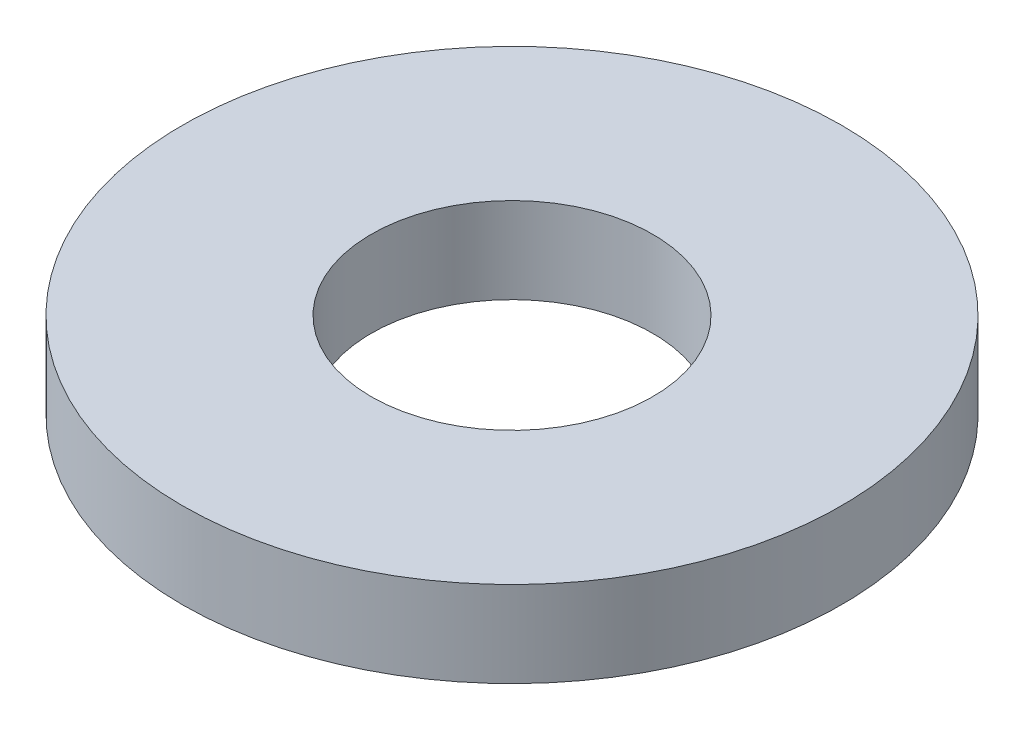
ISO-10303-21;
HEADER;
FILE_DESCRIPTION(('STEP AP214'),'2;1');
FILE_NAME('part.step','',(''),(''),'','','');
FILE_SCHEMA(('AUTOMOTIVE_DESIGN { 1 0 10303 214 1 1 1 1 }'));
ENDSEC;
DATA;
#1=APPLICATION_CONTEXT('core data for automotive mechanical design processes');
#2=APPLICATION_PROTOCOL_DEFINITION('international standard','automotive_design',2000,#1);
#3=PRODUCT_CONTEXT('',#1,'mechanical');
#4=PRODUCT('Part','Part','',(#3));
#5=PRODUCT_RELATED_PRODUCT_CATEGORY('part','',(#4));
#6=PRODUCT_DEFINITION_FORMATION('','',#4);
#7=PRODUCT_DEFINITION_CONTEXT('part definition',#1,'design');
#8=PRODUCT_DEFINITION('design','',#6,#7);
#9=PRODUCT_DEFINITION_SHAPE('','',#8);
#10=(LENGTH_UNIT() NAMED_UNIT(*) SI_UNIT(.MILLI.,.METRE.));
#11=(NAMED_UNIT(*) PLANE_ANGLE_UNIT() SI_UNIT($,.RADIAN.));
#12=(NAMED_UNIT(*) SI_UNIT($,.STERADIAN.) SOLID_ANGLE_UNIT());
#13=UNCERTAINTY_MEASURE_WITH_UNIT(LENGTH_MEASURE(1.E-05),#10,'distance_accuracy_value','');
#14=(GEOMETRIC_REPRESENTATION_CONTEXT(3) GLOBAL_UNCERTAINTY_ASSIGNED_CONTEXT((#13)) GLOBAL_UNIT_ASSIGNED_CONTEXT((#10,
#11,#12)) REPRESENTATION_CONTEXT('',''));
#15=CARTESIAN_POINT('',(0.,0.,0.));
#16=DIRECTION('',(0.,0.,1.));
#17=DIRECTION('',(1.,0.,0.));
#18=AXIS2_PLACEMENT_3D('',#15,#16,#17);
#19=CARTESIAN_POINT('',(0.,-0.625,0.));
#20=DIRECTION('',(0.,1.,0.));
#21=DIRECTION('',(0.,0.,1.));
#22=AXIS2_PLACEMENT_3D('',#19,#20,#21);
#23=CYLINDRICAL_SURFACE('',#22,4.8);
#24=CARTESIAN_POINT('',(0.,-0.625,0.));
#25=DIRECTION('',(0.,1.,0.));
#26=DIRECTION('',(0.,0.,1.));
#27=AXIS2_PLACEMENT_3D('',#24,#25,#26);
#28=CIRCLE('',#27,4.8);
#29=CARTESIAN_POINT('',(0.,-0.625,4.8));
#30=VERTEX_POINT('',#29);
#31=EDGE_CURVE('E10',#30,#30,#28,.T.);
#32=ORIENTED_EDGE('',*,*,#31,.T.);
#33=EDGE_LOOP('',(#32));
#34=FACE_BOUND('',#33,.T.);
#35=CARTESIAN_POINT('',(0.,0.625,0.));
#36=DIRECTION('',(0.,1.,0.));
#37=DIRECTION('',(0.,0.,1.));
#38=AXIS2_PLACEMENT_3D('',#35,#36,#37);
#39=CIRCLE('',#38,4.8);
#40=CARTESIAN_POINT('',(0.,0.625,4.8));
#41=VERTEX_POINT('',#40);
#42=EDGE_CURVE('E41',#41,#41,#39,.T.);
#43=ORIENTED_EDGE('',*,*,#42,.F.);
#44=EDGE_LOOP('',(#43));
#45=FACE_BOUND('',#44,.T.);
#46=ADVANCED_FACE('F31',(#34,#45),#23,.T.);
#47=CARTESIAN_POINT('',(0.,-0.625,0.));
#48=DIRECTION('',(0.,1.,0.));
#49=DIRECTION('',(0.,0.,1.));
#50=AXIS2_PLACEMENT_3D('',#47,#48,#49);
#51=PLANE('',#50);
#52=CARTESIAN_POINT('',(0.,-0.625,0.));
#53=DIRECTION('',(0.,1.,0.));
#54=DIRECTION('',(0.,0.,1.));
#55=AXIS2_PLACEMENT_3D('',#52,#53,#54);
#56=CIRCLE('',#55,2.05);
#57=CARTESIAN_POINT('',(0.,-0.625,2.05));
#58=VERTEX_POINT('',#57);
#59=EDGE_CURVE('E37',#58,#58,#56,.T.);
#60=ORIENTED_EDGE('',*,*,#59,.T.);
#61=EDGE_LOOP('',(#60));
#62=FACE_BOUND('',#61,.T.);
#63=ORIENTED_EDGE('',*,*,#31,.F.);
#64=EDGE_LOOP('',(#63));
#65=FACE_BOUND('',#64,.T.);
#66=ADVANCED_FACE('F60',(#62,#65),#51,.F.);
#67=CARTESIAN_POINT('',(0.,-0.625,0.));
#68=DIRECTION('',(0.,1.,0.));
#69=DIRECTION('',(0.,0.,1.));
#70=AXIS2_PLACEMENT_3D('',#67,#68,#69);
#71=CYLINDRICAL_SURFACE('',#70,2.05);
#72=ORIENTED_EDGE('',*,*,#59,.F.);
#73=EDGE_LOOP('',(#72));
#74=FACE_BOUND('',#73,.T.);
#75=CARTESIAN_POINT('',(0.,0.625,0.));
#76=DIRECTION('',(0.,1.,0.));
#77=DIRECTION('',(0.,0.,1.));
#78=AXIS2_PLACEMENT_3D('',#75,#76,#77);
#79=CIRCLE('',#78,2.05);
#80=CARTESIAN_POINT('',(0.,0.625,2.05));
#81=VERTEX_POINT('',#80);
#82=EDGE_CURVE('E45',#81,#81,#79,.T.);
#83=ORIENTED_EDGE('',*,*,#82,.T.);
#84=EDGE_LOOP('',(#83));
#85=FACE_BOUND('',#84,.T.);
#86=ADVANCED_FACE('F51',(#74,#85),#71,.F.);
#87=CARTESIAN_POINT('',(0.,0.625,0.));
#88=DIRECTION('',(0.,1.,0.));
#89=DIRECTION('',(0.,0.,1.));
#90=AXIS2_PLACEMENT_3D('',#87,#88,#89);
#91=PLANE('',#90);
#92=ORIENTED_EDGE('',*,*,#42,.T.);
#93=EDGE_LOOP('',(#92));
#94=FACE_BOUND('',#93,.T.);
#95=ORIENTED_EDGE('',*,*,#82,.F.);
#96=EDGE_LOOP('',(#95));
#97=FACE_BOUND('',#96,.T.);
#98=ADVANCED_FACE('F53',(#94,#97),#91,.T.);
#99=CLOSED_SHELL('',(#46,#66,#86,#98));
#100=MANIFOLD_SOLID_BREP('B2',#99);
#101=ADVANCED_BREP_SHAPE_REPRESENTATION('',(#18,#100),#14);
#102=SHAPE_DEFINITION_REPRESENTATION(#9,#101);
ENDSEC;
END-ISO-10303-21;
